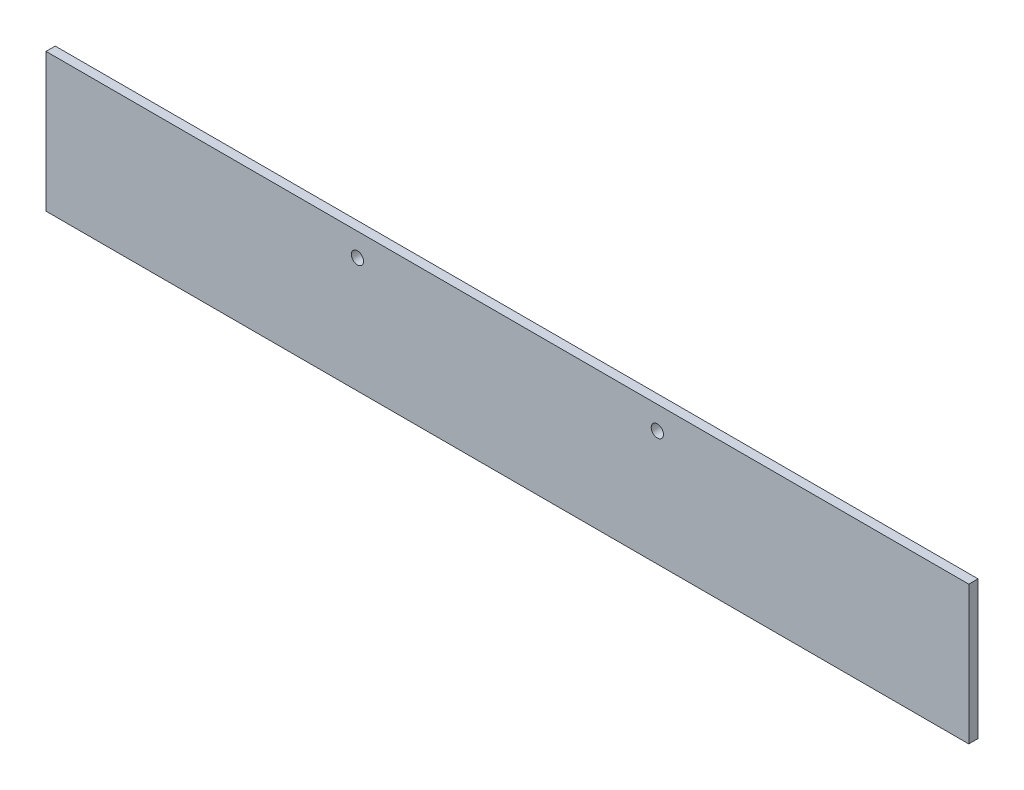
ISO-10303-21;
HEADER;
FILE_DESCRIPTION(('STEP AP214'),'2;1');
FILE_NAME('part.step','',(''),(''),'','','');
FILE_SCHEMA(('AUTOMOTIVE_DESIGN { 1 0 10303 214 1 1 1 1 }'));
ENDSEC;
DATA;
#1=APPLICATION_CONTEXT('core data for automotive mechanical design processes');
#2=APPLICATION_PROTOCOL_DEFINITION('international standard','automotive_design',2000,#1);
#3=PRODUCT_CONTEXT('',#1,'mechanical');
#4=PRODUCT('Part','Part','',(#3));
#5=PRODUCT_RELATED_PRODUCT_CATEGORY('part','',(#4));
#6=PRODUCT_DEFINITION_FORMATION('','',#4);
#7=PRODUCT_DEFINITION_CONTEXT('part definition',#1,'design');
#8=PRODUCT_DEFINITION('design','',#6,#7);
#9=PRODUCT_DEFINITION_SHAPE('','',#8);
#10=(LENGTH_UNIT() NAMED_UNIT(*) SI_UNIT(.MILLI.,.METRE.));
#11=(NAMED_UNIT(*) PLANE_ANGLE_UNIT() SI_UNIT($,.RADIAN.));
#12=(NAMED_UNIT(*) SI_UNIT($,.STERADIAN.) SOLID_ANGLE_UNIT());
#13=UNCERTAINTY_MEASURE_WITH_UNIT(LENGTH_MEASURE(1.E-05),#10,'distance_accuracy_value','');
#14=(GEOMETRIC_REPRESENTATION_CONTEXT(3) GLOBAL_UNCERTAINTY_ASSIGNED_CONTEXT((#13)) GLOBAL_UNIT_ASSIGNED_CONTEXT((#10,
#11,#12)) REPRESENTATION_CONTEXT('',''));
#15=CARTESIAN_POINT('',(0.,0.,0.));
#16=DIRECTION('',(0.,0.,1.));
#17=DIRECTION('',(1.,0.,0.));
#18=AXIS2_PLACEMENT_3D('',#15,#16,#17);
#19=CARTESIAN_POINT('',(0.,0.,4.));
#20=DIRECTION('',(0.,0.,1.));
#21=DIRECTION('',(1.,0.,0.));
#22=AXIS2_PLACEMENT_3D('',#19,#20,#21);
#23=PLANE('',#22);
#24=CARTESIAN_POINT('',(-65.,20.,4.));
#25=DIRECTION('',(0.,0.,1.));
#26=DIRECTION('',(1.,0.,0.));
#27=AXIS2_PLACEMENT_3D('',#24,#25,#26);
#28=CIRCLE('',#27,2.65);
#29=CARTESIAN_POINT('',(-62.35,20.,4.));
#30=VERTEX_POINT('',#29);
#31=EDGE_CURVE('E102',#30,#30,#28,.T.);
#32=ORIENTED_EDGE('',*,*,#31,.F.);
#33=EDGE_LOOP('',(#32));
#34=FACE_BOUND('',#33,.T.);
#35=DIRECTION('',(0.,1.,0.));
#36=VECTOR('',#35,1.);
#37=CARTESIAN_POINT('',(200.,30.,4.));
#38=LINE('',#37,#36);
#39=CARTESIAN_POINT('',(200.,-30.,4.));
#40=VERTEX_POINT('',#39);
#41=CARTESIAN_POINT('',(200.,30.,4.));
#42=VERTEX_POINT('',#41);
#43=EDGE_CURVE('E87',#40,#42,#38,.T.);
#44=ORIENTED_EDGE('',*,*,#43,.T.);
#45=DIRECTION('',(-1.,0.,0.));
#46=VECTOR('',#45,1.);
#47=CARTESIAN_POINT('',(-200.,30.,4.));
#48=LINE('',#47,#46);
#49=CARTESIAN_POINT('',(-200.,30.,4.));
#50=VERTEX_POINT('',#49);
#51=EDGE_CURVE('E82',#42,#50,#48,.T.);
#52=ORIENTED_EDGE('',*,*,#51,.T.);
#53=DIRECTION('',(0.,-1.,0.));
#54=VECTOR('',#53,1.);
#55=CARTESIAN_POINT('',(-200.,30.,4.));
#56=LINE('',#55,#54);
#57=CARTESIAN_POINT('',(-200.,-30.,4.));
#58=VERTEX_POINT('',#57);
#59=EDGE_CURVE('E85',#50,#58,#56,.T.);
#60=ORIENTED_EDGE('',*,*,#59,.T.);
#61=DIRECTION('',(1.,0.,0.));
#62=VECTOR('',#61,1.);
#63=CARTESIAN_POINT('',(-200.,-30.,4.));
#64=LINE('',#63,#62);
#65=EDGE_CURVE('E52',#58,#40,#64,.T.);
#66=ORIENTED_EDGE('',*,*,#65,.T.);
#67=EDGE_LOOP('',(#44,#52,#60,#66));
#68=FACE_BOUND('',#67,.T.);
#69=CARTESIAN_POINT('',(65.,20.,4.));
#70=DIRECTION('',(0.,0.,1.));
#71=DIRECTION('',(1.,0.,0.));
#72=AXIS2_PLACEMENT_3D('',#69,#70,#71);
#73=CIRCLE('',#72,2.65);
#74=CARTESIAN_POINT('',(67.65,20.,4.));
#75=VERTEX_POINT('',#74);
#76=EDGE_CURVE('E117',#75,#75,#73,.T.);
#77=ORIENTED_EDGE('',*,*,#76,.F.);
#78=EDGE_LOOP('',(#77));
#79=FACE_BOUND('',#78,.T.);
#80=ADVANCED_FACE('F35',(#34,#68,#79),#23,.T.);
#81=CARTESIAN_POINT('',(0.,0.,0.));
#82=DIRECTION('',(0.,0.,1.));
#83=DIRECTION('',(1.,0.,0.));
#84=AXIS2_PLACEMENT_3D('',#81,#82,#83);
#85=PLANE('',#84);
#86=DIRECTION('',(0.,1.,0.));
#87=VECTOR('',#86,1.);
#88=CARTESIAN_POINT('',(200.,30.,0.));
#89=LINE('',#88,#87);
#90=CARTESIAN_POINT('',(200.,-30.,0.));
#91=VERTEX_POINT('',#90);
#92=CARTESIAN_POINT('',(200.,30.,0.));
#93=VERTEX_POINT('',#92);
#94=EDGE_CURVE('E99',#91,#93,#89,.T.);
#95=ORIENTED_EDGE('',*,*,#94,.F.);
#96=DIRECTION('',(1.,0.,0.));
#97=VECTOR('',#96,1.);
#98=CARTESIAN_POINT('',(-200.,-30.,0.));
#99=LINE('',#98,#97);
#100=CARTESIAN_POINT('',(-200.,-30.,0.));
#101=VERTEX_POINT('',#100);
#102=EDGE_CURVE('E75',#101,#91,#99,.T.);
#103=ORIENTED_EDGE('',*,*,#102,.F.);
#104=DIRECTION('',(0.,-1.,0.));
#105=VECTOR('',#104,1.);
#106=CARTESIAN_POINT('',(-200.,30.,0.));
#107=LINE('',#106,#105);
#108=CARTESIAN_POINT('',(-200.,30.,0.));
#109=VERTEX_POINT('',#108);
#110=EDGE_CURVE('E69',#109,#101,#107,.T.);
#111=ORIENTED_EDGE('',*,*,#110,.F.);
#112=DIRECTION('',(-1.,0.,0.));
#113=VECTOR('',#112,1.);
#114=CARTESIAN_POINT('',(-200.,30.,0.));
#115=LINE('',#114,#113);
#116=EDGE_CURVE('E91',#93,#109,#115,.T.);
#117=ORIENTED_EDGE('',*,*,#116,.F.);
#118=EDGE_LOOP('',(#95,#103,#111,#117));
#119=FACE_BOUND('',#118,.T.);
#120=CARTESIAN_POINT('',(-65.,20.,0.));
#121=DIRECTION('',(0.,0.,1.));
#122=DIRECTION('',(1.,0.,0.));
#123=AXIS2_PLACEMENT_3D('',#120,#121,#122);
#124=CIRCLE('',#123,2.65);
#125=CARTESIAN_POINT('',(-62.35,20.,0.));
#126=VERTEX_POINT('',#125);
#127=EDGE_CURVE('E114',#126,#126,#124,.T.);
#128=ORIENTED_EDGE('',*,*,#127,.T.);
#129=EDGE_LOOP('',(#128));
#130=FACE_BOUND('',#129,.T.);
#131=CARTESIAN_POINT('',(65.,20.,0.));
#132=DIRECTION('',(0.,0.,1.));
#133=DIRECTION('',(1.,0.,0.));
#134=AXIS2_PLACEMENT_3D('',#131,#132,#133);
#135=CIRCLE('',#134,2.65);
#136=CARTESIAN_POINT('',(67.65,20.,0.));
#137=VERTEX_POINT('',#136);
#138=EDGE_CURVE('E120',#137,#137,#135,.T.);
#139=ORIENTED_EDGE('',*,*,#138,.T.);
#140=EDGE_LOOP('',(#139));
#141=FACE_BOUND('',#140,.T.);
#142=ADVANCED_FACE('F110',(#119,#130,#141),#85,.F.);
#143=CARTESIAN_POINT('',(200.,30.,4.));
#144=DIRECTION('',(-1.,0.,0.));
#145=DIRECTION('',(0.,0.,1.));
#146=AXIS2_PLACEMENT_3D('',#143,#144,#145);
#147=PLANE('',#146);
#148=ORIENTED_EDGE('',*,*,#94,.T.);
#149=DIRECTION('',(0.,0.,-1.));
#150=VECTOR('',#149,1.);
#151=CARTESIAN_POINT('',(200.,30.,4.));
#152=LINE('',#151,#150);
#153=EDGE_CURVE('E11',#42,#93,#152,.T.);
#154=ORIENTED_EDGE('',*,*,#153,.F.);
#155=ORIENTED_EDGE('',*,*,#43,.F.);
#156=DIRECTION('',(0.,0.,-1.));
#157=VECTOR('',#156,1.);
#158=CARTESIAN_POINT('',(200.,-30.,4.));
#159=LINE('',#158,#157);
#160=EDGE_CURVE('E95',#40,#91,#159,.T.);
#161=ORIENTED_EDGE('',*,*,#160,.T.);
#162=EDGE_LOOP('',(#148,#154,#155,#161));
#163=FACE_BOUND('',#162,.T.);
#164=ADVANCED_FACE('F37',(#163),#147,.F.);
#165=CARTESIAN_POINT('',(-200.,30.,4.));
#166=DIRECTION('',(0.,-1.,0.));
#167=DIRECTION('',(0.,0.,-1.));
#168=AXIS2_PLACEMENT_3D('',#165,#166,#167);
#169=PLANE('',#168);
#170=ORIENTED_EDGE('',*,*,#116,.T.);
#171=DIRECTION('',(0.,0.,-1.));
#172=VECTOR('',#171,1.);
#173=CARTESIAN_POINT('',(-200.,30.,4.));
#174=LINE('',#173,#172);
#175=EDGE_CURVE('E44',#50,#109,#174,.T.);
#176=ORIENTED_EDGE('',*,*,#175,.F.);
#177=ORIENTED_EDGE('',*,*,#51,.F.);
#178=ORIENTED_EDGE('',*,*,#153,.T.);
#179=EDGE_LOOP('',(#170,#176,#177,#178));
#180=FACE_BOUND('',#179,.T.);
#181=ADVANCED_FACE('F90',(#180),#169,.F.);
#182=CARTESIAN_POINT('',(-200.,30.,4.));
#183=DIRECTION('',(1.,0.,0.));
#184=DIRECTION('',(0.,0.,-1.));
#185=AXIS2_PLACEMENT_3D('',#182,#183,#184);
#186=PLANE('',#185);
#187=ORIENTED_EDGE('',*,*,#110,.T.);
#188=DIRECTION('',(0.,0.,-1.));
#189=VECTOR('',#188,1.);
#190=CARTESIAN_POINT('',(-200.,-30.,4.));
#191=LINE('',#190,#189);
#192=EDGE_CURVE('E92',#58,#101,#191,.T.);
#193=ORIENTED_EDGE('',*,*,#192,.F.);
#194=ORIENTED_EDGE('',*,*,#59,.F.);
#195=ORIENTED_EDGE('',*,*,#175,.T.);
#196=EDGE_LOOP('',(#187,#193,#194,#195));
#197=FACE_BOUND('',#196,.T.);
#198=ADVANCED_FACE('F93',(#197),#186,.F.);
#199=CARTESIAN_POINT('',(-200.,-30.,4.));
#200=DIRECTION('',(0.,1.,0.));
#201=DIRECTION('',(0.,0.,1.));
#202=AXIS2_PLACEMENT_3D('',#199,#200,#201);
#203=PLANE('',#202);
#204=ORIENTED_EDGE('',*,*,#102,.T.);
#205=ORIENTED_EDGE('',*,*,#160,.F.);
#206=ORIENTED_EDGE('',*,*,#65,.F.);
#207=ORIENTED_EDGE('',*,*,#192,.T.);
#208=EDGE_LOOP('',(#204,#205,#206,#207));
#209=FACE_BOUND('',#208,.T.);
#210=ADVANCED_FACE('F107',(#209),#203,.F.);
#211=CARTESIAN_POINT('',(-65.,20.,4.));
#212=DIRECTION('',(0.,0.,-1.));
#213=DIRECTION('',(-1.,0.,0.));
#214=AXIS2_PLACEMENT_3D('',#211,#212,#213);
#215=CYLINDRICAL_SURFACE('',#214,2.65);
#216=ORIENTED_EDGE('',*,*,#31,.T.);
#217=EDGE_LOOP('',(#216));
#218=FACE_BOUND('',#217,.T.);
#219=ORIENTED_EDGE('',*,*,#127,.F.);
#220=EDGE_LOOP('',(#219));
#221=FACE_BOUND('',#220,.T.);
#222=ADVANCED_FACE('F137',(#218,#221),#215,.F.);
#223=CARTESIAN_POINT('',(65.,20.,4.));
#224=DIRECTION('',(0.,0.,-1.));
#225=DIRECTION('',(-1.,0.,0.));
#226=AXIS2_PLACEMENT_3D('',#223,#224,#225);
#227=CYLINDRICAL_SURFACE('',#226,2.65);
#228=ORIENTED_EDGE('',*,*,#76,.T.);
#229=EDGE_LOOP('',(#228));
#230=FACE_BOUND('',#229,.T.);
#231=ORIENTED_EDGE('',*,*,#138,.F.);
#232=EDGE_LOOP('',(#231));
#233=FACE_BOUND('',#232,.T.);
#234=ADVANCED_FACE('F126',(#230,#233),#227,.F.);
#235=CLOSED_SHELL('',(#80,#142,#164,#181,#198,#210,#222,#234));
#236=MANIFOLD_SOLID_BREP('B2',#235);
#237=ADVANCED_BREP_SHAPE_REPRESENTATION('',(#18,#236),#14);
#238=SHAPE_DEFINITION_REPRESENTATION(#9,#237);
ENDSEC;
END-ISO-10303-21;
